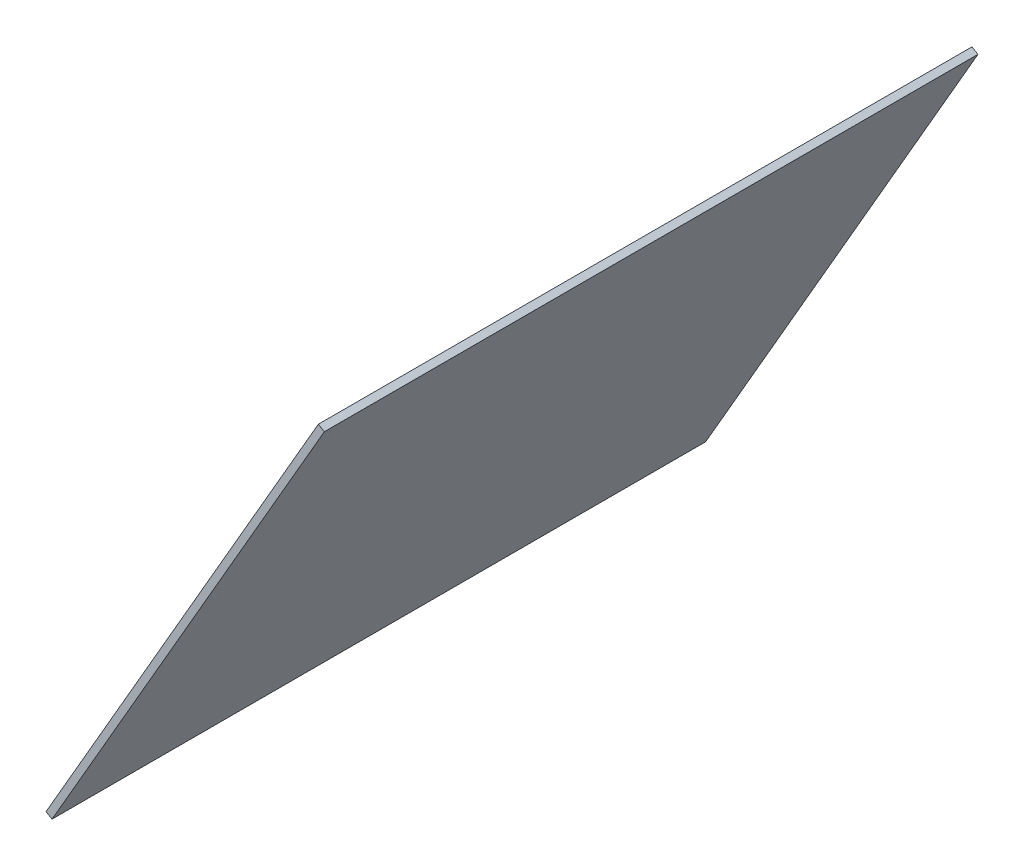
ISO-10303-21;
HEADER;
FILE_DESCRIPTION(('STEP AP214'),'2;1');
FILE_NAME('part.step','',(''),(''),'','','');
FILE_SCHEMA(('AUTOMOTIVE_DESIGN { 1 0 10303 214 1 1 1 1 }'));
ENDSEC;
DATA;
#1=APPLICATION_CONTEXT('core data for automotive mechanical design processes');
#2=APPLICATION_PROTOCOL_DEFINITION('international standard','automotive_design',2000,#1);
#3=PRODUCT_CONTEXT('',#1,'mechanical');
#4=PRODUCT('Part','Part','',(#3));
#5=PRODUCT_RELATED_PRODUCT_CATEGORY('part','',(#4));
#6=PRODUCT_DEFINITION_FORMATION('','',#4);
#7=PRODUCT_DEFINITION_CONTEXT('part definition',#1,'design');
#8=PRODUCT_DEFINITION('design','',#6,#7);
#9=PRODUCT_DEFINITION_SHAPE('','',#8);
#10=(LENGTH_UNIT() NAMED_UNIT(*) SI_UNIT(.MILLI.,.METRE.));
#11=(NAMED_UNIT(*) PLANE_ANGLE_UNIT() SI_UNIT($,.RADIAN.));
#12=(NAMED_UNIT(*) SI_UNIT($,.STERADIAN.) SOLID_ANGLE_UNIT());
#13=UNCERTAINTY_MEASURE_WITH_UNIT(LENGTH_MEASURE(1.E-05),#10,'distance_accuracy_value','');
#14=(GEOMETRIC_REPRESENTATION_CONTEXT(3) GLOBAL_UNCERTAINTY_ASSIGNED_CONTEXT((#13)) GLOBAL_UNIT_ASSIGNED_CONTEXT((#10,
#11,#12)) REPRESENTATION_CONTEXT('',''));
#15=CARTESIAN_POINT('',(0.,0.,0.));
#16=DIRECTION('',(0.,0.,1.));
#17=DIRECTION('',(1.,0.,0.));
#18=AXIS2_PLACEMENT_3D('',#15,#16,#17);
#19=CARTESIAN_POINT('',(146.324865405186,-2.91433543964104E-13,-240.602811050998));
#20=DIRECTION('',(0.866025403784439,-0.5,0.));
#21=DIRECTION('',(0.5,0.866025403784439,0.));
#22=AXIS2_PLACEMENT_3D('',#19,#20,#21);
#23=PLANE('',#22);
#24=DIRECTION('',(0.,0.,1.));
#25=VECTOR('',#24,1.);
#26=CARTESIAN_POINT('',(263.824865405186,203.515969889343,-240.602811050998));
#27=LINE('',#26,#25);
#28=CARTESIAN_POINT('',(263.824865405186,203.515969889343,-2.99999999999995));
#29=VERTEX_POINT('',#28);
#30=CARTESIAN_POINT('',(263.824865405186,203.515969889343,279.));
#31=VERTEX_POINT('',#30);
#32=EDGE_CURVE('E70',#29,#31,#27,.T.);
#33=ORIENTED_EDGE('',*,*,#32,.F.);
#34=DIRECTION('',(-0.5,-0.866025403784439,0.));
#35=VECTOR('',#34,1.);
#36=CARTESIAN_POINT('',(146.324865405186,-2.72856722071064E-13,-2.99999999999992));
#37=LINE('',#36,#35);
#38=CARTESIAN_POINT('',(146.324865405186,-2.89013319746367E-13,-2.99999999999989));
#39=VERTEX_POINT('',#38);
#40=EDGE_CURVE('E40',#29,#39,#37,.T.);
#41=ORIENTED_EDGE('',*,*,#40,.T.);
#42=DIRECTION('',(0.,0.,1.));
#43=VECTOR('',#42,1.);
#44=CARTESIAN_POINT('',(146.324865405186,-2.91433543964104E-13,-240.602811050998));
#45=LINE('',#44,#43);
#46=CARTESIAN_POINT('',(146.324865405186,-2.91433543964104E-13,279.));
#47=VERTEX_POINT('',#46);
#48=EDGE_CURVE('E90',#39,#47,#45,.T.);
#49=ORIENTED_EDGE('',*,*,#48,.T.);
#50=DIRECTION('',(0.5,0.866025403784439,0.));
#51=VECTOR('',#50,1.);
#52=CARTESIAN_POINT('',(146.324865405186,-2.91433543964104E-13,279.));
#53=LINE('',#52,#51);
#54=EDGE_CURVE('E84',#47,#31,#53,.T.);
#55=ORIENTED_EDGE('',*,*,#54,.T.);
#56=EDGE_LOOP('',(#33,#41,#49,#55));
#57=FACE_BOUND('',#56,.T.);
#58=ADVANCED_FACE('F33',(#57),#23,.F.);
#59=CARTESIAN_POINT('',(263.824865405186,203.515969889343,-240.602811050998));
#60=DIRECTION('',(-0.499999999999992,-0.866025403784443,0.));
#61=DIRECTION('',(0.866025403784443,-0.499999999999992,0.));
#62=AXIS2_PLACEMENT_3D('',#59,#60,#61);
#63=PLANE('',#62);
#64=DIRECTION('',(0.,0.,1.));
#65=VECTOR('',#64,1.);
#66=CARTESIAN_POINT('',(266.422941616539,202.015969889343,-240.602811050998));
#67=LINE('',#66,#65);
#68=CARTESIAN_POINT('',(266.422941616539,202.015969889343,-2.99999999999994));
#69=VERTEX_POINT('',#68);
#70=CARTESIAN_POINT('',(266.422941616539,202.015969889343,279.));
#71=VERTEX_POINT('',#70);
#72=EDGE_CURVE('E79',#69,#71,#67,.T.);
#73=ORIENTED_EDGE('',*,*,#72,.F.);
#74=DIRECTION('',(-0.866025403784443,0.499999999999992,0.));
#75=VECTOR('',#74,1.);
#76=CARTESIAN_POINT('',(263.824865405186,203.515969889343,-2.99999999999995));
#77=LINE('',#76,#75);
#78=EDGE_CURVE('E47',#69,#29,#77,.T.);
#79=ORIENTED_EDGE('',*,*,#78,.T.);
#80=ORIENTED_EDGE('',*,*,#32,.T.);
#81=DIRECTION('',(0.866025403784443,-0.499999999999992,0.));
#82=VECTOR('',#81,1.);
#83=CARTESIAN_POINT('',(263.824865405186,203.515969889343,279.));
#84=LINE('',#83,#82);
#85=EDGE_CURVE('E74',#31,#71,#84,.T.);
#86=ORIENTED_EDGE('',*,*,#85,.T.);
#87=EDGE_LOOP('',(#73,#79,#80,#86));
#88=FACE_BOUND('',#87,.T.);
#89=ADVANCED_FACE('F73',(#88),#63,.F.);
#90=CARTESIAN_POINT('',(148.922941616539,-1.50000000000029,-240.602811050998));
#91=DIRECTION('',(0.866025403784439,-0.5,0.));
#92=DIRECTION('',(0.5,0.866025403784439,0.));
#93=AXIS2_PLACEMENT_3D('',#90,#91,#92);
#94=PLANE('',#93);
#95=DIRECTION('',(-0.5,-0.866025403784439,0.));
#96=VECTOR('',#95,1.);
#97=CARTESIAN_POINT('',(148.922941616539,-1.50000000000027,-2.99999999999992));
#98=LINE('',#97,#96);
#99=CARTESIAN_POINT('',(148.922941616539,-1.50000000000029,-2.99999999999989));
#100=VERTEX_POINT('',#99);
#101=EDGE_CURVE('E78',#69,#100,#98,.T.);
#102=ORIENTED_EDGE('',*,*,#101,.F.);
#103=ORIENTED_EDGE('',*,*,#72,.T.);
#104=DIRECTION('',(0.5,0.866025403784439,0.));
#105=VECTOR('',#104,1.);
#106=CARTESIAN_POINT('',(148.922941616539,-1.50000000000029,279.));
#107=LINE('',#106,#105);
#108=CARTESIAN_POINT('',(148.922941616539,-1.50000000000029,279.));
#109=VERTEX_POINT('',#108);
#110=EDGE_CURVE('E87',#109,#71,#107,.T.);
#111=ORIENTED_EDGE('',*,*,#110,.F.);
#112=DIRECTION('',(0.,0.,1.));
#113=VECTOR('',#112,1.);
#114=CARTESIAN_POINT('',(148.922941616539,-1.50000000000029,-240.602811050998));
#115=LINE('',#114,#113);
#116=EDGE_CURVE('E99',#100,#109,#115,.T.);
#117=ORIENTED_EDGE('',*,*,#116,.F.);
#118=EDGE_LOOP('',(#102,#103,#111,#117));
#119=FACE_BOUND('',#118,.T.);
#120=ADVANCED_FACE('F102',(#119),#94,.T.);
#121=CARTESIAN_POINT('',(146.324865405186,-2.91433543964104E-13,-240.602811050998));
#122=DIRECTION('',(-0.500000000000001,-0.866025403784438,0.));
#123=DIRECTION('',(0.866025403784438,-0.500000000000001,0.));
#124=AXIS2_PLACEMENT_3D('',#121,#122,#123);
#125=PLANE('',#124);
#126=DIRECTION('',(-0.866025403784438,0.500000000000001,0.));
#127=VECTOR('',#126,1.);
#128=CARTESIAN_POINT('',(146.324865405186,-2.73818736503984E-13,-2.99999999999989));
#129=LINE('',#128,#127);
#130=EDGE_CURVE('E11',#100,#39,#129,.T.);
#131=ORIENTED_EDGE('',*,*,#130,.F.);
#132=ORIENTED_EDGE('',*,*,#116,.T.);
#133=DIRECTION('',(0.866025403784438,-0.500000000000001,0.));
#134=VECTOR('',#133,1.);
#135=CARTESIAN_POINT('',(146.324865405186,-2.91433543964104E-13,279.));
#136=LINE('',#135,#134);
#137=EDGE_CURVE('E96',#47,#109,#136,.T.);
#138=ORIENTED_EDGE('',*,*,#137,.F.);
#139=ORIENTED_EDGE('',*,*,#48,.F.);
#140=EDGE_LOOP('',(#131,#132,#138,#139));
#141=FACE_BOUND('',#140,.T.);
#142=ADVANCED_FACE('F106',(#141),#125,.T.);
#143=CARTESIAN_POINT('',(0.,0.,279.));
#144=DIRECTION('',(0.,0.,-1.));
#145=DIRECTION('',(-1.,0.,0.));
#146=AXIS2_PLACEMENT_3D('',#143,#144,#145);
#147=PLANE('',#146);
#148=ORIENTED_EDGE('',*,*,#54,.F.);
#149=ORIENTED_EDGE('',*,*,#137,.T.);
#150=ORIENTED_EDGE('',*,*,#110,.T.);
#151=ORIENTED_EDGE('',*,*,#85,.F.);
#152=EDGE_LOOP('',(#148,#149,#150,#151));
#153=FACE_BOUND('',#152,.T.);
#154=ADVANCED_FACE('F82',(#153),#147,.F.);
#155=CARTESIAN_POINT('',(267.499999999999,209.881489732212,-2.99999999999995));
#156=DIRECTION('',(0.,0.,1.));
#157=DIRECTION('',(-0.499999999999995,0.866025403784442,0.));
#158=AXIS2_PLACEMENT_3D('',#155,#156,#157);
#159=PLANE('',#158);
#160=ORIENTED_EDGE('',*,*,#78,.F.);
#161=ORIENTED_EDGE('',*,*,#101,.T.);
#162=ORIENTED_EDGE('',*,*,#130,.T.);
#163=ORIENTED_EDGE('',*,*,#40,.F.);
#164=EDGE_LOOP('',(#160,#161,#162,#163));
#165=FACE_BOUND('',#164,.T.);
#166=ADVANCED_FACE('F113',(#165),#159,.F.);
#167=CLOSED_SHELL('',(#58,#89,#120,#142,#154,#166));
#168=MANIFOLD_SOLID_BREP('B2',#167);
#169=ADVANCED_BREP_SHAPE_REPRESENTATION('',(#18,#168),#14);
#170=SHAPE_DEFINITION_REPRESENTATION(#9,#169);
ENDSEC;
END-ISO-10303-21;
